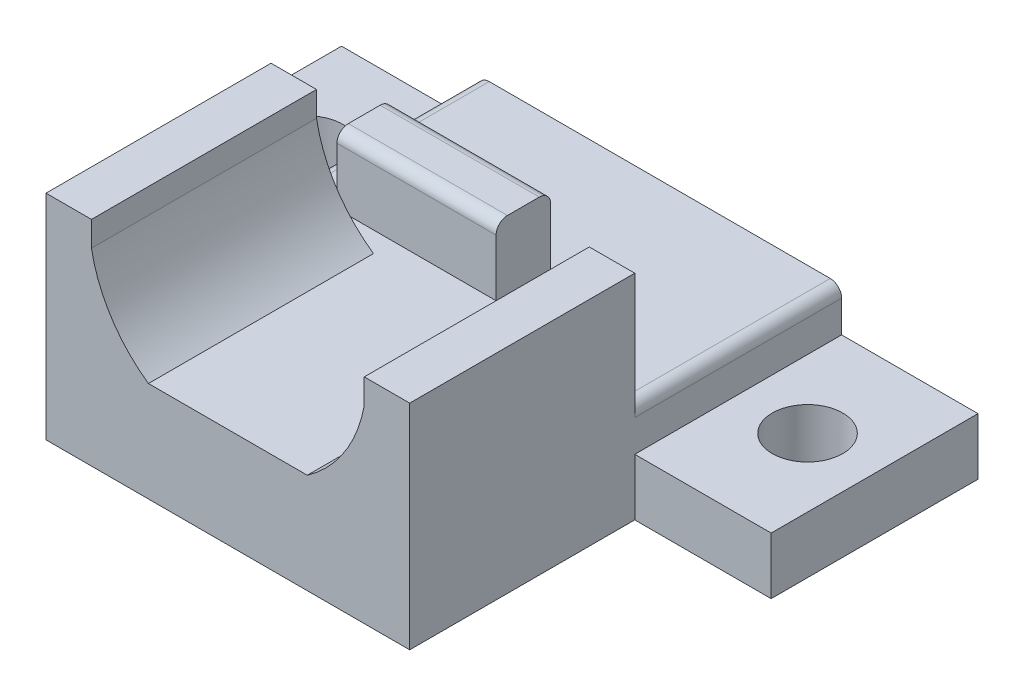
ISO-10303-21;
HEADER;
FILE_DESCRIPTION(('STEP AP214'),'2;1');
FILE_NAME('part.step','',(''),(''),'','','');
FILE_SCHEMA(('AUTOMOTIVE_DESIGN { 1 0 10303 214 1 1 1 1 }'));
ENDSEC;
DATA;
#1=APPLICATION_CONTEXT('core data for automotive mechanical design processes');
#2=APPLICATION_PROTOCOL_DEFINITION('international standard','automotive_design',2000,#1);
#3=PRODUCT_CONTEXT('',#1,'mechanical');
#4=PRODUCT('Part','Part','',(#3));
#5=PRODUCT_RELATED_PRODUCT_CATEGORY('part','',(#4));
#6=PRODUCT_DEFINITION_FORMATION('','',#4);
#7=PRODUCT_DEFINITION_CONTEXT('part definition',#1,'design');
#8=PRODUCT_DEFINITION('design','',#6,#7);
#9=PRODUCT_DEFINITION_SHAPE('','',#8);
#10=(LENGTH_UNIT() NAMED_UNIT(*) SI_UNIT(.MILLI.,.METRE.));
#11=(NAMED_UNIT(*) PLANE_ANGLE_UNIT() SI_UNIT($,.RADIAN.));
#12=(NAMED_UNIT(*) SI_UNIT($,.STERADIAN.) SOLID_ANGLE_UNIT());
#13=UNCERTAINTY_MEASURE_WITH_UNIT(LENGTH_MEASURE(1.E-05),#10,'distance_accuracy_value','');
#14=(GEOMETRIC_REPRESENTATION_CONTEXT(3) GLOBAL_UNCERTAINTY_ASSIGNED_CONTEXT((#13)) GLOBAL_UNIT_ASSIGNED_CONTEXT((#10,
#11,#12)) REPRESENTATION_CONTEXT('',''));
#15=CARTESIAN_POINT('',(0.,0.,0.));
#16=DIRECTION('',(0.,0.,1.));
#17=DIRECTION('',(1.,0.,0.));
#18=AXIS2_PLACEMENT_3D('',#15,#16,#17);
#19=CARTESIAN_POINT('',(0.,4.4,0.));
#20=DIRECTION('',(0.,-1.,0.));
#21=DIRECTION('',(0.,0.,-1.));
#22=AXIS2_PLACEMENT_3D('',#19,#20,#21);
#23=PLANE('',#22);
#24=DIRECTION('',(-1.,0.,0.));
#25=VECTOR('',#24,1.);
#26=CARTESIAN_POINT('',(8.14560264732086,4.4,-0.400000000000001));
#27=LINE('',#26,#25);
#28=CARTESIAN_POINT('',(7.5,4.4,-0.400000000000001));
#29=VERTEX_POINT('',#28);
#30=CARTESIAN_POINT('',(3.49428104193123,4.4,-0.400000000000001));
#31=VERTEX_POINT('',#30);
#32=EDGE_CURVE('E324',#29,#31,#27,.T.);
#33=ORIENTED_EDGE('',*,*,#32,.F.);
#34=DIRECTION('',(0.,0.,1.));
#35=VECTOR('',#34,1.);
#36=CARTESIAN_POINT('',(7.5,4.4,0.));
#37=LINE('',#36,#35);
#38=CARTESIAN_POINT('',(7.5,4.4,-9.5));
#39=VERTEX_POINT('',#38);
#40=EDGE_CURVE('E480',#29,#39,#37,.F.);
#41=ORIENTED_EDGE('',*,*,#40,.T.);
#42=DIRECTION('',(-1.,0.,0.));
#43=VECTOR('',#42,1.);
#44=CARTESIAN_POINT('',(-6.,4.4,-9.5));
#45=LINE('',#44,#43);
#46=CARTESIAN_POINT('',(-7.5,4.4,-9.5));
#47=VERTEX_POINT('',#46);
#48=EDGE_CURVE('E425',#39,#47,#45,.T.);
#49=ORIENTED_EDGE('',*,*,#48,.T.);
#50=DIRECTION('',(0.,0.,-1.));
#51=VECTOR('',#50,1.);
#52=CARTESIAN_POINT('',(-7.5,4.4,0.));
#53=LINE('',#52,#51);
#54=CARTESIAN_POINT('',(-7.5,4.4,-0.400000000000001));
#55=VERTEX_POINT('',#54);
#56=EDGE_CURVE('E478',#47,#55,#53,.F.);
#57=ORIENTED_EDGE('',*,*,#56,.T.);
#58=CARTESIAN_POINT('',(-3.49428104193123,4.4,-0.400000000000001));
#59=VERTEX_POINT('',#58);
#60=EDGE_CURVE('E321',#59,#55,#27,.T.);
#61=ORIENTED_EDGE('',*,*,#60,.F.);
#62=DIRECTION('',(0.,0.,1.));
#63=VECTOR('',#62,1.);
#64=CARTESIAN_POINT('',(-3.49428104193123,4.4,-9.5));
#65=LINE('',#64,#63);
#66=CARTESIAN_POINT('',(-3.49428104193123,4.4,9.5));
#67=VERTEX_POINT('',#66);
#68=EDGE_CURVE('E357',#59,#67,#65,.T.);
#69=ORIENTED_EDGE('',*,*,#68,.T.);
#70=DIRECTION('',(1.,0.,0.));
#71=VECTOR('',#70,1.);
#72=CARTESIAN_POINT('',(0.,4.4,9.5));
#73=LINE('',#72,#71);
#74=CARTESIAN_POINT('',(3.49428104193123,4.4,9.5));
#75=VERTEX_POINT('',#74);
#76=EDGE_CURVE('E344',#67,#75,#73,.T.);
#77=ORIENTED_EDGE('',*,*,#76,.T.);
#78=DIRECTION('',(0.,0.,1.));
#79=VECTOR('',#78,1.);
#80=CARTESIAN_POINT('',(3.49428104193123,4.4,-9.5));
#81=LINE('',#80,#79);
#82=EDGE_CURVE('E355',#31,#75,#81,.T.);
#83=ORIENTED_EDGE('',*,*,#82,.F.);
#84=EDGE_LOOP('',(#33,#41,#49,#57,#61,#69,#77,#83));
#85=FACE_BOUND('',#84,.T.);
#86=DIRECTION('',(0.,0.,1.));
#87=VECTOR('',#86,1.);
#88=CARTESIAN_POINT('',(-6.,4.4,-3.7));
#89=LINE('',#88,#87);
#90=CARTESIAN_POINT('',(-6.,4.4,-3.7));
#91=VERTEX_POINT('',#90);
#92=CARTESIAN_POINT('',(-6.,4.4,-1.3));
#93=VERTEX_POINT('',#92);
#94=EDGE_CURVE('E288',#91,#93,#89,.T.);
#95=ORIENTED_EDGE('',*,*,#94,.F.);
#96=DIRECTION('',(-1.,0.,0.));
#97=VECTOR('',#96,1.);
#98=CARTESIAN_POINT('',(-6.,4.4,-3.7));
#99=LINE('',#98,#97);
#100=CARTESIAN_POINT('',(1.,4.4,-3.7));
#101=VERTEX_POINT('',#100);
#102=EDGE_CURVE('E301',#101,#91,#99,.T.);
#103=ORIENTED_EDGE('',*,*,#102,.F.);
#104=DIRECTION('',(0.,0.,-1.));
#105=VECTOR('',#104,1.);
#106=CARTESIAN_POINT('',(1.,4.4,-3.7));
#107=LINE('',#106,#105);
#108=CARTESIAN_POINT('',(1.,4.4,-1.3));
#109=VERTEX_POINT('',#108);
#110=EDGE_CURVE('E309',#109,#101,#107,.T.);
#111=ORIENTED_EDGE('',*,*,#110,.F.);
#112=DIRECTION('',(1.,0.,0.));
#113=VECTOR('',#112,1.);
#114=CARTESIAN_POINT('',(-6.,4.4,-1.3));
#115=LINE('',#114,#113);
#116=EDGE_CURVE('E304',#93,#109,#115,.T.);
#117=ORIENTED_EDGE('',*,*,#116,.F.);
#118=EDGE_LOOP('',(#95,#103,#111,#117));
#119=FACE_BOUND('',#118,.T.);
#120=ADVANCED_FACE('F111',(#85,#119),#23,.F.);
#121=CARTESIAN_POINT('',(-8.,13.3,9.5));
#122=DIRECTION('',(0.,0.,-1.));
#123=DIRECTION('',(-1.,0.,0.));
#124=AXIS2_PLACEMENT_3D('',#121,#122,#123);
#125=PLANE('',#124);
#126=DIRECTION('',(0.,-1.,0.));
#127=VECTOR('',#126,1.);
#128=CARTESIAN_POINT('',(6.,0.,9.5));
#129=LINE('',#128,#127);
#130=CARTESIAN_POINT('',(6.,9.4,9.5));
#131=VERTEX_POINT('',#130);
#132=CARTESIAN_POINT('',(6.,8.30000000000001,9.5));
#133=VERTEX_POINT('',#132);
#134=EDGE_CURVE('E348',#131,#133,#129,.T.);
#135=ORIENTED_EDGE('',*,*,#134,.T.);
#136=CARTESIAN_POINT('',(0.,9.4,9.5));
#137=DIRECTION('',(0.,0.,1.));
#138=DIRECTION('',(1.,0.,0.));
#139=AXIS2_PLACEMENT_3D('',#136,#137,#138);
#140=CIRCLE('',#139,6.1);
#141=EDGE_CURVE('E345',#75,#133,#140,.T.);
#142=ORIENTED_EDGE('',*,*,#141,.F.);
#143=ORIENTED_EDGE('',*,*,#76,.F.);
#144=CARTESIAN_POINT('',(-6.,8.30000000000001,9.5));
#145=VERTEX_POINT('',#144);
#146=EDGE_CURVE('E341',#145,#67,#140,.T.);
#147=ORIENTED_EDGE('',*,*,#146,.F.);
#148=DIRECTION('',(0.,-1.,0.));
#149=VECTOR('',#148,1.);
#150=CARTESIAN_POINT('',(-6.,0.,9.5));
#151=LINE('',#150,#149);
#152=CARTESIAN_POINT('',(-6.,9.4,9.5));
#153=VERTEX_POINT('',#152);
#154=EDGE_CURVE('E338',#153,#145,#151,.T.);
#155=ORIENTED_EDGE('',*,*,#154,.F.);
#156=DIRECTION('',(1.,0.,0.));
#157=VECTOR('',#156,1.);
#158=CARTESIAN_POINT('',(-8.,9.4,9.5));
#159=LINE('',#158,#157);
#160=CARTESIAN_POINT('',(-8.,9.4,9.5));
#161=VERTEX_POINT('',#160);
#162=EDGE_CURVE('E420',#161,#153,#159,.T.);
#163=ORIENTED_EDGE('',*,*,#162,.F.);
#164=DIRECTION('',(0.,-1.,0.));
#165=VECTOR('',#164,1.);
#166=CARTESIAN_POINT('',(-8.,13.3,9.5));
#167=LINE('',#166,#165);
#168=CARTESIAN_POINT('',(-8.,0.,9.5));
#169=VERTEX_POINT('',#168);
#170=EDGE_CURVE('E439',#161,#169,#167,.T.);
#171=ORIENTED_EDGE('',*,*,#170,.T.);
#172=DIRECTION('',(1.,0.,0.));
#173=VECTOR('',#172,1.);
#174=CARTESIAN_POINT('',(-8.,0.,9.5));
#175=LINE('',#174,#173);
#176=CARTESIAN_POINT('',(8.,0.,9.5));
#177=VERTEX_POINT('',#176);
#178=EDGE_CURVE('E434',#169,#177,#175,.T.);
#179=ORIENTED_EDGE('',*,*,#178,.T.);
#180=DIRECTION('',(0.,-1.,0.));
#181=VECTOR('',#180,1.);
#182=CARTESIAN_POINT('',(8.,13.3,9.5));
#183=LINE('',#182,#181);
#184=CARTESIAN_POINT('',(8.,9.4,9.5));
#185=VERTEX_POINT('',#184);
#186=EDGE_CURVE('E437',#185,#177,#183,.T.);
#187=ORIENTED_EDGE('',*,*,#186,.F.);
#188=EDGE_CURVE('E415',#131,#185,#159,.T.);
#189=ORIENTED_EDGE('',*,*,#188,.F.);
#190=EDGE_LOOP('',(#135,#142,#143,#147,#155,#163,#171,#179,#187,#189));
#191=FACE_BOUND('',#190,.T.);
#192=ADVANCED_FACE('F546',(#191),#125,.F.);
#193=CARTESIAN_POINT('',(6.,4.4,9.5));
#194=DIRECTION('',(1.,0.,0.));
#195=DIRECTION('',(0.,0.,-1.));
#196=AXIS2_PLACEMENT_3D('',#193,#194,#195);
#197=PLANE('',#196);
#198=DIRECTION('',(0.,0.,-1.));
#199=VECTOR('',#198,1.);
#200=CARTESIAN_POINT('',(6.,9.4,9.5));
#201=LINE('',#200,#199);
#202=CARTESIAN_POINT('',(6.,9.4,-0.400000000000001));
#203=VERTEX_POINT('',#202);
#204=EDGE_CURVE('E418',#131,#203,#201,.T.);
#205=ORIENTED_EDGE('',*,*,#204,.T.);
#206=DIRECTION('',(0.,-1.,0.));
#207=VECTOR('',#206,1.);
#208=CARTESIAN_POINT('',(6.,4.4,-0.400000000000001));
#209=LINE('',#208,#207);
#210=CARTESIAN_POINT('',(6.,8.30000000000001,-0.400000000000001));
#211=VERTEX_POINT('',#210);
#212=EDGE_CURVE('E332',#203,#211,#209,.T.);
#213=ORIENTED_EDGE('',*,*,#212,.T.);
#214=DIRECTION('',(0.,0.,1.));
#215=VECTOR('',#214,1.);
#216=CARTESIAN_POINT('',(6.,8.30000000000001,-9.5));
#217=LINE('',#216,#215);
#218=EDGE_CURVE('E352',#211,#133,#217,.T.);
#219=ORIENTED_EDGE('',*,*,#218,.T.);
#220=ORIENTED_EDGE('',*,*,#134,.F.);
#221=EDGE_LOOP('',(#205,#213,#219,#220));
#222=FACE_BOUND('',#221,.T.);
#223=ADVANCED_FACE('F553',(#222),#197,.F.);
#224=CARTESIAN_POINT('',(-6.,4.4,9.5));
#225=DIRECTION('',(-1.,0.,0.));
#226=DIRECTION('',(0.,0.,1.));
#227=AXIS2_PLACEMENT_3D('',#224,#225,#226);
#228=PLANE('',#227);
#229=DIRECTION('',(0.,0.,1.));
#230=VECTOR('',#229,1.);
#231=CARTESIAN_POINT('',(-6.,8.30000000000001,-9.5));
#232=LINE('',#231,#230);
#233=CARTESIAN_POINT('',(-6.,8.30000000000001,-0.400000000000001));
#234=VERTEX_POINT('',#233);
#235=EDGE_CURVE('E351',#234,#145,#232,.T.);
#236=ORIENTED_EDGE('',*,*,#235,.F.);
#237=DIRECTION('',(0.,1.,0.));
#238=VECTOR('',#237,1.);
#239=CARTESIAN_POINT('',(-6.,4.4,-0.400000000000001));
#240=LINE('',#239,#238);
#241=CARTESIAN_POINT('',(-6.,9.4,-0.400000000000001));
#242=VERTEX_POINT('',#241);
#243=EDGE_CURVE('E326',#234,#242,#240,.T.);
#244=ORIENTED_EDGE('',*,*,#243,.T.);
#245=DIRECTION('',(0.,0.,1.));
#246=VECTOR('',#245,1.);
#247=CARTESIAN_POINT('',(-6.,9.4,9.5));
#248=LINE('',#247,#246);
#249=EDGE_CURVE('E446',#242,#153,#248,.T.);
#250=ORIENTED_EDGE('',*,*,#249,.T.);
#251=ORIENTED_EDGE('',*,*,#154,.T.);
#252=EDGE_LOOP('',(#236,#244,#250,#251));
#253=FACE_BOUND('',#252,.T.);
#254=ADVANCED_FACE('F589',(#253),#228,.F.);
#255=CARTESIAN_POINT('',(8.,13.3,9.5));
#256=DIRECTION('',(-1.,0.,0.));
#257=DIRECTION('',(0.,0.,1.));
#258=AXIS2_PLACEMENT_3D('',#255,#256,#257);
#259=PLANE('',#258);
#260=DIRECTION('',(0.,-1.,0.));
#261=VECTOR('',#260,1.);
#262=CARTESIAN_POINT('',(8.,13.3,-9.5));
#263=LINE('',#262,#261);
#264=CARTESIAN_POINT('',(8.,3.9,-9.5));
#265=VERTEX_POINT('',#264);
#266=CARTESIAN_POINT('',(8.,2.5,-9.5));
#267=VERTEX_POINT('',#266);
#268=EDGE_CURVE('E444',#265,#267,#263,.T.);
#269=ORIENTED_EDGE('',*,*,#268,.F.);
#270=DIRECTION('',(0.,0.,1.));
#271=VECTOR('',#270,1.);
#272=CARTESIAN_POINT('',(8.,3.9,9.5));
#273=LINE('',#272,#271);
#274=CARTESIAN_POINT('',(8.,3.9,-0.400000000000001));
#275=VERTEX_POINT('',#274);
#276=EDGE_CURVE('E475',#265,#275,#273,.T.);
#277=ORIENTED_EDGE('',*,*,#276,.T.);
#278=DIRECTION('',(0.,1.,0.));
#279=VECTOR('',#278,1.);
#280=CARTESIAN_POINT('',(8.,13.3,-0.400000000000001));
#281=LINE('',#280,#279);
#282=CARTESIAN_POINT('',(8.,9.4,-0.400000000000001));
#283=VERTEX_POINT('',#282);
#284=EDGE_CURVE('E335',#275,#283,#281,.T.);
#285=ORIENTED_EDGE('',*,*,#284,.T.);
#286=DIRECTION('',(0.,0.,-1.));
#287=VECTOR('',#286,1.);
#288=CARTESIAN_POINT('',(8.,9.4,9.5));
#289=LINE('',#288,#287);
#290=EDGE_CURVE('E410',#185,#283,#289,.T.);
#291=ORIENTED_EDGE('',*,*,#290,.F.);
#292=ORIENTED_EDGE('',*,*,#186,.T.);
#293=DIRECTION('',(0.,0.,-1.));
#294=VECTOR('',#293,1.);
#295=CARTESIAN_POINT('',(8.,0.,9.5));
#296=LINE('',#295,#294);
#297=CARTESIAN_POINT('',(8.,0.,-0.400000000000001));
#298=VERTEX_POINT('',#297);
#299=EDGE_CURVE('E428',#177,#298,#296,.T.);
#300=ORIENTED_EDGE('',*,*,#299,.T.);
#301=DIRECTION('',(0.,-1.,0.));
#302=VECTOR('',#301,1.);
#303=CARTESIAN_POINT('',(8.,13.3,-0.400000000000001));
#304=LINE('',#303,#302);
#305=CARTESIAN_POINT('',(8.,2.5,-0.400000000000001));
#306=VERTEX_POINT('',#305);
#307=EDGE_CURVE('E404',#306,#298,#304,.T.);
#308=ORIENTED_EDGE('',*,*,#307,.F.);
#309=DIRECTION('',(0.,0.,-1.));
#310=VECTOR('',#309,1.);
#311=CARTESIAN_POINT('',(8.,2.5,9.5));
#312=LINE('',#311,#310);
#313=EDGE_CURVE('E407',#306,#267,#312,.T.);
#314=ORIENTED_EDGE('',*,*,#313,.T.);
#315=EDGE_LOOP('',(#269,#277,#285,#291,#292,#300,#308,#314));
#316=FACE_BOUND('',#315,.T.);
#317=ADVANCED_FACE('F502',(#316),#259,.F.);
#318=CARTESIAN_POINT('',(-8.,13.3,9.5));
#319=DIRECTION('',(1.,0.,0.));
#320=DIRECTION('',(0.,0.,-1.));
#321=AXIS2_PLACEMENT_3D('',#318,#319,#320);
#322=PLANE('',#321);
#323=DIRECTION('',(0.,1.,0.));
#324=VECTOR('',#323,1.);
#325=CARTESIAN_POINT('',(-8.,4.4,-0.400000000000001));
#326=LINE('',#325,#324);
#327=CARTESIAN_POINT('',(-8.,3.9,-0.400000000000001));
#328=VERTEX_POINT('',#327);
#329=CARTESIAN_POINT('',(-8.,9.4,-0.400000000000001));
#330=VERTEX_POINT('',#329);
#331=EDGE_CURVE('E126',#328,#330,#326,.T.);
#332=ORIENTED_EDGE('',*,*,#331,.F.);
#333=DIRECTION('',(0.,0.,-1.));
#334=VECTOR('',#333,1.);
#335=CARTESIAN_POINT('',(-8.,3.9,9.5));
#336=LINE('',#335,#334);
#337=CARTESIAN_POINT('',(-8.,3.9,-9.5));
#338=VERTEX_POINT('',#337);
#339=EDGE_CURVE('E485',#328,#338,#336,.T.);
#340=ORIENTED_EDGE('',*,*,#339,.T.);
#341=DIRECTION('',(0.,-1.,0.));
#342=VECTOR('',#341,1.);
#343=CARTESIAN_POINT('',(-8.,13.3,-9.5));
#344=LINE('',#343,#342);
#345=CARTESIAN_POINT('',(-8.,2.5,-9.5));
#346=VERTEX_POINT('',#345);
#347=EDGE_CURVE('E442',#338,#346,#344,.T.);
#348=ORIENTED_EDGE('',*,*,#347,.T.);
#349=DIRECTION('',(0.,0.,1.));
#350=VECTOR('',#349,1.);
#351=CARTESIAN_POINT('',(-8.,2.5,9.5));
#352=LINE('',#351,#350);
#353=CARTESIAN_POINT('',(-8.,2.5,-0.400000000000001));
#354=VERTEX_POINT('',#353);
#355=EDGE_CURVE('E448',#346,#354,#352,.T.);
#356=ORIENTED_EDGE('',*,*,#355,.T.);
#357=DIRECTION('',(0.,1.,0.));
#358=VECTOR('',#357,1.);
#359=CARTESIAN_POINT('',(-8.,13.3,-0.400000000000001));
#360=LINE('',#359,#358);
#361=CARTESIAN_POINT('',(-8.,0.,-0.400000000000001));
#362=VERTEX_POINT('',#361);
#363=EDGE_CURVE('E401',#362,#354,#360,.T.);
#364=ORIENTED_EDGE('',*,*,#363,.F.);
#365=DIRECTION('',(0.,0.,1.));
#366=VECTOR('',#365,1.);
#367=CARTESIAN_POINT('',(-8.,0.,9.5));
#368=LINE('',#367,#366);
#369=EDGE_CURVE('E432',#362,#169,#368,.T.);
#370=ORIENTED_EDGE('',*,*,#369,.T.);
#371=ORIENTED_EDGE('',*,*,#170,.F.);
#372=DIRECTION('',(0.,0.,-1.));
#373=VECTOR('',#372,1.);
#374=CARTESIAN_POINT('',(-8.,9.4,9.5));
#375=LINE('',#374,#373);
#376=EDGE_CURVE('E413',#161,#330,#375,.T.);
#377=ORIENTED_EDGE('',*,*,#376,.T.);
#378=EDGE_LOOP('',(#332,#340,#348,#356,#364,#370,#371,#377));
#379=FACE_BOUND('',#378,.T.);
#380=ADVANCED_FACE('F530',(#379),#322,.F.);
#381=CARTESIAN_POINT('',(-8.,13.3,-9.5));
#382=DIRECTION('',(0.,0.,1.));
#383=DIRECTION('',(1.,0.,0.));
#384=AXIS2_PLACEMENT_3D('',#381,#382,#383);
#385=PLANE('',#384);
#386=ORIENTED_EDGE('',*,*,#48,.F.);
#387=CARTESIAN_POINT('',(7.5,3.9,-9.5));
#388=DIRECTION('',(0.,0.,1.));
#389=DIRECTION('',(1.,0.,0.));
#390=AXIS2_PLACEMENT_3D('',#387,#388,#389);
#391=CIRCLE('',#390,0.5);
#392=EDGE_CURVE('E483',#39,#265,#391,.F.);
#393=ORIENTED_EDGE('',*,*,#392,.T.);
#394=ORIENTED_EDGE('',*,*,#268,.T.);
#395=DIRECTION('',(1.,0.,0.));
#396=VECTOR('',#395,1.);
#397=CARTESIAN_POINT('',(0.,2.5,-9.5));
#398=LINE('',#397,#396);
#399=CARTESIAN_POINT('',(14.,2.5,-9.5));
#400=VERTEX_POINT('',#399);
#401=EDGE_CURVE('E369',#267,#400,#398,.T.);
#402=ORIENTED_EDGE('',*,*,#401,.T.);
#403=DIRECTION('',(0.,-1.,0.));
#404=VECTOR('',#403,1.);
#405=CARTESIAN_POINT('',(14.,2.5,-9.5));
#406=LINE('',#405,#404);
#407=CARTESIAN_POINT('',(14.,0.,-9.5));
#408=VERTEX_POINT('',#407);
#409=EDGE_CURVE('E398',#400,#408,#406,.T.);
#410=ORIENTED_EDGE('',*,*,#409,.T.);
#411=DIRECTION('',(-1.,0.,0.));
#412=VECTOR('',#411,1.);
#413=CARTESIAN_POINT('',(-8.,0.,-9.5));
#414=LINE('',#413,#412);
#415=CARTESIAN_POINT('',(-14.,0.,-9.5));
#416=VERTEX_POINT('',#415);
#417=EDGE_CURVE('E430',#408,#416,#414,.T.);
#418=ORIENTED_EDGE('',*,*,#417,.T.);
#419=DIRECTION('',(0.,-1.,0.));
#420=VECTOR('',#419,1.);
#421=CARTESIAN_POINT('',(-14.,2.5,-9.5));
#422=LINE('',#421,#420);
#423=CARTESIAN_POINT('',(-14.,2.5,-9.5));
#424=VERTEX_POINT('',#423);
#425=EDGE_CURVE('E395',#424,#416,#422,.T.);
#426=ORIENTED_EDGE('',*,*,#425,.F.);
#427=EDGE_CURVE('E371',#424,#346,#398,.T.);
#428=ORIENTED_EDGE('',*,*,#427,.T.);
#429=ORIENTED_EDGE('',*,*,#347,.F.);
#430=CARTESIAN_POINT('',(-7.5,3.9,-9.5));
#431=DIRECTION('',(0.,0.,1.));
#432=DIRECTION('',(1.,0.,0.));
#433=AXIS2_PLACEMENT_3D('',#430,#431,#432);
#434=CIRCLE('',#433,0.5);
#435=EDGE_CURVE('E133',#338,#47,#434,.F.);
#436=ORIENTED_EDGE('',*,*,#435,.T.);
#437=EDGE_LOOP('',(#386,#393,#394,#402,#410,#418,#426,#428,#429,#436));
#438=FACE_BOUND('',#437,.T.);
#439=ADVANCED_FACE('F500',(#438),#385,.F.);
#440=CARTESIAN_POINT('',(0.,0.,0.));
#441=DIRECTION('',(0.,-1.,0.));
#442=DIRECTION('',(0.,0.,-1.));
#443=AXIS2_PLACEMENT_3D('',#440,#441,#442);
#444=PLANE('',#443);
#445=CARTESIAN_POINT('',(-11.,0.,-5.));
#446=DIRECTION('',(0.,1.,0.));
#447=DIRECTION('',(0.,0.,1.));
#448=AXIS2_PLACEMENT_3D('',#445,#446,#447);
#449=CIRCLE('',#448,1.55);
#450=CARTESIAN_POINT('',(-11.,0.,-3.45));
#451=VERTEX_POINT('',#450);
#452=EDGE_CURVE('E360',#451,#451,#449,.T.);
#453=ORIENTED_EDGE('',*,*,#452,.T.);
#454=EDGE_LOOP('',(#453));
#455=FACE_BOUND('',#454,.T.);
#456=CARTESIAN_POINT('',(11.,0.,-5.));
#457=DIRECTION('',(0.,1.,0.));
#458=DIRECTION('',(0.,0.,-1.));
#459=AXIS2_PLACEMENT_3D('',#456,#457,#458);
#460=CIRCLE('',#459,1.55);
#461=CARTESIAN_POINT('',(11.,0.,-6.55));
#462=VERTEX_POINT('',#461);
#463=EDGE_CURVE('E354',#462,#462,#460,.T.);
#464=ORIENTED_EDGE('',*,*,#463,.T.);
#465=EDGE_LOOP('',(#464));
#466=FACE_BOUND('',#465,.T.);
#467=ORIENTED_EDGE('',*,*,#417,.F.);
#468=DIRECTION('',(0.,0.,1.));
#469=VECTOR('',#468,1.);
#470=CARTESIAN_POINT('',(14.,0.,0.));
#471=LINE('',#470,#469);
#472=CARTESIAN_POINT('',(14.,0.,-0.400000000000001));
#473=VERTEX_POINT('',#472);
#474=EDGE_CURVE('E381',#408,#473,#471,.T.);
#475=ORIENTED_EDGE('',*,*,#474,.T.);
#476=DIRECTION('',(1.,0.,0.));
#477=VECTOR('',#476,1.);
#478=CARTESIAN_POINT('',(0.,0.,-0.400000000000001));
#479=LINE('',#478,#477);
#480=EDGE_CURVE('E387',#298,#473,#479,.T.);
#481=ORIENTED_EDGE('',*,*,#480,.F.);
#482=ORIENTED_EDGE('',*,*,#299,.F.);
#483=ORIENTED_EDGE('',*,*,#178,.F.);
#484=ORIENTED_EDGE('',*,*,#369,.F.);
#485=CARTESIAN_POINT('',(-14.,0.,-0.400000000000001));
#486=VERTEX_POINT('',#485);
#487=EDGE_CURVE('E370',#486,#362,#479,.T.);
#488=ORIENTED_EDGE('',*,*,#487,.F.);
#489=DIRECTION('',(0.,0.,1.));
#490=VECTOR('',#489,1.);
#491=CARTESIAN_POINT('',(-14.,0.,0.));
#492=LINE('',#491,#490);
#493=EDGE_CURVE('E384',#416,#486,#492,.T.);
#494=ORIENTED_EDGE('',*,*,#493,.F.);
#495=EDGE_LOOP('',(#467,#475,#481,#482,#483,#484,#488,#494));
#496=FACE_BOUND('',#495,.T.);
#497=ADVANCED_FACE('F516',(#455,#466,#496),#444,.T.);
#498=CARTESIAN_POINT('',(-8.,9.4,9.5));
#499=DIRECTION('',(0.,-1.,0.));
#500=DIRECTION('',(0.,0.,-1.));
#501=AXIS2_PLACEMENT_3D('',#498,#499,#500);
#502=PLANE('',#501);
#503=DIRECTION('',(1.,0.,0.));
#504=VECTOR('',#503,1.);
#505=CARTESIAN_POINT('',(-8.,9.4,-0.4));
#506=LINE('',#505,#504);
#507=EDGE_CURVE('E416',#330,#242,#506,.T.);
#508=ORIENTED_EDGE('',*,*,#507,.F.);
#509=ORIENTED_EDGE('',*,*,#376,.F.);
#510=ORIENTED_EDGE('',*,*,#162,.T.);
#511=ORIENTED_EDGE('',*,*,#249,.F.);
#512=EDGE_LOOP('',(#508,#509,#510,#511));
#513=FACE_BOUND('',#512,.T.);
#514=ADVANCED_FACE('F596',(#513),#502,.F.);
#515=ORIENTED_EDGE('',*,*,#188,.T.);
#516=ORIENTED_EDGE('',*,*,#290,.T.);
#517=EDGE_CURVE('E419',#203,#283,#506,.T.);
#518=ORIENTED_EDGE('',*,*,#517,.F.);
#519=ORIENTED_EDGE('',*,*,#204,.F.);
#520=EDGE_LOOP('',(#515,#516,#518,#519));
#521=FACE_BOUND('',#520,.T.);
#522=ADVANCED_FACE('F557',(#521),#502,.F.);
#523=CARTESIAN_POINT('',(-14.,2.5,0.));
#524=DIRECTION('',(1.,0.,0.));
#525=DIRECTION('',(0.,0.,-1.));
#526=AXIS2_PLACEMENT_3D('',#523,#524,#525);
#527=PLANE('',#526);
#528=ORIENTED_EDGE('',*,*,#493,.T.);
#529=DIRECTION('',(0.,-1.,0.));
#530=VECTOR('',#529,1.);
#531=CARTESIAN_POINT('',(-14.,2.5,-0.400000000000001));
#532=LINE('',#531,#530);
#533=CARTESIAN_POINT('',(-14.,2.5,-0.400000000000001));
#534=VERTEX_POINT('',#533);
#535=EDGE_CURVE('E392',#534,#486,#532,.T.);
#536=ORIENTED_EDGE('',*,*,#535,.F.);
#537=DIRECTION('',(0.,0.,1.));
#538=VECTOR('',#537,1.);
#539=CARTESIAN_POINT('',(-14.,2.5,0.));
#540=LINE('',#539,#538);
#541=EDGE_CURVE('E374',#424,#534,#540,.T.);
#542=ORIENTED_EDGE('',*,*,#541,.F.);
#543=ORIENTED_EDGE('',*,*,#425,.T.);
#544=EDGE_LOOP('',(#528,#536,#542,#543));
#545=FACE_BOUND('',#544,.T.);
#546=ADVANCED_FACE('F522',(#545),#527,.F.);
#547=CARTESIAN_POINT('',(0.,2.5,0.));
#548=DIRECTION('',(0.,1.,0.));
#549=DIRECTION('',(0.,0.,1.));
#550=AXIS2_PLACEMENT_3D('',#547,#548,#549);
#551=PLANE('',#550);
#552=CARTESIAN_POINT('',(-11.,2.5,-5.));
#553=DIRECTION('',(0.,1.,0.));
#554=DIRECTION('',(0.,0.,1.));
#555=AXIS2_PLACEMENT_3D('',#552,#553,#554);
#556=CIRCLE('',#555,1.55);
#557=CARTESIAN_POINT('',(-11.,2.5,-3.45));
#558=VERTEX_POINT('',#557);
#559=EDGE_CURVE('E385',#558,#558,#556,.T.);
#560=ORIENTED_EDGE('',*,*,#559,.F.);
#561=EDGE_LOOP('',(#560));
#562=FACE_BOUND('',#561,.T.);
#563=ORIENTED_EDGE('',*,*,#355,.F.);
#564=ORIENTED_EDGE('',*,*,#427,.F.);
#565=ORIENTED_EDGE('',*,*,#541,.T.);
#566=DIRECTION('',(1.,0.,0.));
#567=VECTOR('',#566,1.);
#568=CARTESIAN_POINT('',(0.,2.5,-0.400000000000001));
#569=LINE('',#568,#567);
#570=EDGE_CURVE('E377',#534,#354,#569,.T.);
#571=ORIENTED_EDGE('',*,*,#570,.T.);
#572=EDGE_LOOP('',(#563,#564,#565,#571));
#573=FACE_BOUND('',#572,.T.);
#574=ADVANCED_FACE('F528',(#562,#573),#551,.T.);
#575=CARTESIAN_POINT('',(0.,2.5,-0.400000000000001));
#576=DIRECTION('',(0.,0.,-1.));
#577=DIRECTION('',(-1.,0.,0.));
#578=AXIS2_PLACEMENT_3D('',#575,#576,#577);
#579=PLANE('',#578);
#580=ORIENTED_EDGE('',*,*,#487,.T.);
#581=ORIENTED_EDGE('',*,*,#363,.T.);
#582=ORIENTED_EDGE('',*,*,#570,.F.);
#583=ORIENTED_EDGE('',*,*,#535,.T.);
#584=EDGE_LOOP('',(#580,#581,#582,#583));
#585=FACE_BOUND('',#584,.T.);
#586=ADVANCED_FACE('F567',(#585),#579,.F.);
#587=CARTESIAN_POINT('',(11.,2.5,-5.));
#588=DIRECTION('',(0.,1.,0.));
#589=DIRECTION('',(0.,0.,1.));
#590=AXIS2_PLACEMENT_3D('',#587,#588,#589);
#591=CIRCLE('',#590,1.55);
#592=CARTESIAN_POINT('',(11.,2.5,-3.45));
#593=VERTEX_POINT('',#592);
#594=EDGE_CURVE('E363',#593,#593,#591,.T.);
#595=ORIENTED_EDGE('',*,*,#594,.F.);
#596=EDGE_LOOP('',(#595));
#597=FACE_BOUND('',#596,.T.);
#598=ORIENTED_EDGE('',*,*,#313,.F.);
#599=CARTESIAN_POINT('',(14.,2.5,-0.400000000000001));
#600=VERTEX_POINT('',#599);
#601=EDGE_CURVE('E376',#306,#600,#569,.T.);
#602=ORIENTED_EDGE('',*,*,#601,.T.);
#603=DIRECTION('',(0.,0.,1.));
#604=VECTOR('',#603,1.);
#605=CARTESIAN_POINT('',(14.,2.5,0.));
#606=LINE('',#605,#604);
#607=EDGE_CURVE('E366',#400,#600,#606,.T.);
#608=ORIENTED_EDGE('',*,*,#607,.F.);
#609=ORIENTED_EDGE('',*,*,#401,.F.);
#610=EDGE_LOOP('',(#598,#602,#608,#609));
#611=FACE_BOUND('',#610,.T.);
#612=ADVANCED_FACE('F508',(#597,#611),#551,.T.);
#613=ORIENTED_EDGE('',*,*,#601,.F.);
#614=ORIENTED_EDGE('',*,*,#307,.T.);
#615=ORIENTED_EDGE('',*,*,#480,.T.);
#616=DIRECTION('',(0.,-1.,0.));
#617=VECTOR('',#616,1.);
#618=CARTESIAN_POINT('',(14.,2.5,-0.400000000000001));
#619=LINE('',#618,#617);
#620=EDGE_CURVE('E380',#600,#473,#619,.T.);
#621=ORIENTED_EDGE('',*,*,#620,.F.);
#622=EDGE_LOOP('',(#613,#614,#615,#621));
#623=FACE_BOUND('',#622,.T.);
#624=ADVANCED_FACE('F564',(#623),#579,.F.);
#625=CARTESIAN_POINT('',(14.,2.5,0.));
#626=DIRECTION('',(1.,0.,0.));
#627=DIRECTION('',(0.,0.,-1.));
#628=AXIS2_PLACEMENT_3D('',#625,#626,#627);
#629=PLANE('',#628);
#630=ORIENTED_EDGE('',*,*,#474,.F.);
#631=ORIENTED_EDGE('',*,*,#409,.F.);
#632=ORIENTED_EDGE('',*,*,#607,.T.);
#633=ORIENTED_EDGE('',*,*,#620,.T.);
#634=EDGE_LOOP('',(#630,#631,#632,#633));
#635=FACE_BOUND('',#634,.T.);
#636=ADVANCED_FACE('F512',(#635),#629,.T.);
#637=CARTESIAN_POINT('',(11.,0.,-5.));
#638=DIRECTION('',(0.,1.,0.));
#639=DIRECTION('',(0.,0.,1.));
#640=AXIS2_PLACEMENT_3D('',#637,#638,#639);
#641=CYLINDRICAL_SURFACE('',#640,1.55);
#642=ORIENTED_EDGE('',*,*,#594,.T.);
#643=EDGE_LOOP('',(#642));
#644=FACE_BOUND('',#643,.T.);
#645=ORIENTED_EDGE('',*,*,#463,.F.);
#646=EDGE_LOOP('',(#645));
#647=FACE_BOUND('',#646,.T.);
#648=ADVANCED_FACE('F572',(#644,#647),#641,.F.);
#649=CARTESIAN_POINT('',(-11.,0.,-5.));
#650=DIRECTION('',(0.,1.,0.));
#651=DIRECTION('',(0.,0.,1.));
#652=AXIS2_PLACEMENT_3D('',#649,#650,#651);
#653=CYLINDRICAL_SURFACE('',#652,1.55);
#654=ORIENTED_EDGE('',*,*,#559,.T.);
#655=EDGE_LOOP('',(#654));
#656=FACE_BOUND('',#655,.T.);
#657=ORIENTED_EDGE('',*,*,#452,.F.);
#658=EDGE_LOOP('',(#657));
#659=FACE_BOUND('',#658,.T.);
#660=ADVANCED_FACE('F715',(#656,#659),#653,.F.);
#661=CARTESIAN_POINT('',(0.,9.4,-9.5));
#662=DIRECTION('',(0.,0.,1.));
#663=DIRECTION('',(1.,0.,0.));
#664=AXIS2_PLACEMENT_3D('',#661,#662,#663);
#665=CYLINDRICAL_SURFACE('',#664,6.1);
#666=ORIENTED_EDGE('',*,*,#218,.F.);
#667=CARTESIAN_POINT('',(0.,9.4,-0.400000000000001));
#668=DIRECTION('',(0.,0.,1.));
#669=DIRECTION('',(1.,0.,0.));
#670=AXIS2_PLACEMENT_3D('',#667,#668,#669);
#671=CIRCLE('',#670,6.1);
#672=EDGE_CURVE('E329',#211,#31,#671,.F.);
#673=ORIENTED_EDGE('',*,*,#672,.T.);
#674=ORIENTED_EDGE('',*,*,#82,.T.);
#675=ORIENTED_EDGE('',*,*,#141,.T.);
#676=EDGE_LOOP('',(#666,#673,#674,#675));
#677=FACE_BOUND('',#676,.T.);
#678=ADVANCED_FACE('F551',(#677),#665,.F.);
#679=ORIENTED_EDGE('',*,*,#68,.F.);
#680=CARTESIAN_POINT('',(0.,9.4,-0.400000000000001));
#681=DIRECTION('',(0.,0.,1.));
#682=DIRECTION('',(1.,0.,0.));
#683=AXIS2_PLACEMENT_3D('',#680,#681,#682);
#684=CIRCLE('',#683,6.1);
#685=EDGE_CURVE('E450',#59,#234,#684,.F.);
#686=ORIENTED_EDGE('',*,*,#685,.T.);
#687=ORIENTED_EDGE('',*,*,#235,.T.);
#688=ORIENTED_EDGE('',*,*,#146,.T.);
#689=EDGE_LOOP('',(#679,#686,#687,#688));
#690=FACE_BOUND('',#689,.T.);
#691=ADVANCED_FACE('F539',(#690),#665,.F.);
#692=CARTESIAN_POINT('',(0.,0.,-0.400000000000001));
#693=DIRECTION('',(0.,0.,1.));
#694=DIRECTION('',(1.,0.,0.));
#695=AXIS2_PLACEMENT_3D('',#692,#693,#694);
#696=PLANE('',#695);
#697=ORIENTED_EDGE('',*,*,#284,.F.);
#698=CARTESIAN_POINT('',(7.5,3.9,-0.400000000000001));
#699=DIRECTION('',(0.,0.,1.));
#700=DIRECTION('',(1.,0.,0.));
#701=AXIS2_PLACEMENT_3D('',#698,#699,#700);
#702=CIRCLE('',#701,0.5);
#703=EDGE_CURVE('E119',#275,#29,#702,.T.);
#704=ORIENTED_EDGE('',*,*,#703,.T.);
#705=ORIENTED_EDGE('',*,*,#32,.T.);
#706=ORIENTED_EDGE('',*,*,#672,.F.);
#707=ORIENTED_EDGE('',*,*,#212,.F.);
#708=ORIENTED_EDGE('',*,*,#517,.T.);
#709=EDGE_LOOP('',(#697,#704,#705,#706,#707,#708));
#710=FACE_BOUND('',#709,.T.);
#711=ADVANCED_FACE('F489',(#710),#696,.F.);
#712=ORIENTED_EDGE('',*,*,#243,.F.);
#713=ORIENTED_EDGE('',*,*,#685,.F.);
#714=ORIENTED_EDGE('',*,*,#60,.T.);
#715=CARTESIAN_POINT('',(-7.5,3.9,-0.400000000000001));
#716=DIRECTION('',(0.,0.,1.));
#717=DIRECTION('',(1.,0.,0.));
#718=AXIS2_PLACEMENT_3D('',#715,#716,#717);
#719=CIRCLE('',#718,0.5);
#720=EDGE_CURVE('E12',#55,#328,#719,.T.);
#721=ORIENTED_EDGE('',*,*,#720,.T.);
#722=ORIENTED_EDGE('',*,*,#331,.T.);
#723=ORIENTED_EDGE('',*,*,#507,.T.);
#724=EDGE_LOOP('',(#712,#713,#714,#721,#722,#723));
#725=FACE_BOUND('',#724,.T.);
#726=ADVANCED_FACE('F534',(#725),#696,.F.);
#727=CARTESIAN_POINT('',(-6.,7.4,-3.7));
#728=DIRECTION('',(1.,0.,0.));
#729=DIRECTION('',(0.,0.,-1.));
#730=AXIS2_PLACEMENT_3D('',#727,#728,#729);
#731=PLANE('',#730);
#732=DIRECTION('',(0.,-1.,0.));
#733=VECTOR('',#732,1.);
#734=CARTESIAN_POINT('',(-6.,7.4,-1.3));
#735=LINE('',#734,#733);
#736=CARTESIAN_POINT('',(-6.,6.9,-1.3));
#737=VERTEX_POINT('',#736);
#738=EDGE_CURVE('E319',#737,#93,#735,.T.);
#739=ORIENTED_EDGE('',*,*,#738,.F.);
#740=CARTESIAN_POINT('',(-6.,6.9,-1.8));
#741=DIRECTION('',(1.,0.,0.));
#742=DIRECTION('',(0.,0.,-1.));
#743=AXIS2_PLACEMENT_3D('',#740,#741,#742);
#744=CIRCLE('',#743,0.5);
#745=CARTESIAN_POINT('',(-6.,7.4,-1.8));
#746=VERTEX_POINT('',#745);
#747=EDGE_CURVE('E473',#737,#746,#744,.F.);
#748=ORIENTED_EDGE('',*,*,#747,.T.);
#749=DIRECTION('',(0.,0.,1.));
#750=VECTOR('',#749,1.);
#751=CARTESIAN_POINT('',(-6.,7.4,-3.7));
#752=LINE('',#751,#750);
#753=CARTESIAN_POINT('',(-6.,7.4,-3.2));
#754=VERTEX_POINT('',#753);
#755=EDGE_CURVE('E308',#754,#746,#752,.T.);
#756=ORIENTED_EDGE('',*,*,#755,.F.);
#757=CARTESIAN_POINT('',(-6.,6.9,-3.2));
#758=DIRECTION('',(1.,0.,0.));
#759=DIRECTION('',(0.,0.,-1.));
#760=AXIS2_PLACEMENT_3D('',#757,#758,#759);
#761=CIRCLE('',#760,0.5);
#762=CARTESIAN_POINT('',(-6.,6.9,-3.7));
#763=VERTEX_POINT('',#762);
#764=EDGE_CURVE('E290',#754,#763,#761,.F.);
#765=ORIENTED_EDGE('',*,*,#764,.T.);
#766=DIRECTION('',(0.,-1.,0.));
#767=VECTOR('',#766,1.);
#768=CARTESIAN_POINT('',(-6.,7.4,-3.7));
#769=LINE('',#768,#767);
#770=EDGE_CURVE('E284',#763,#91,#769,.T.);
#771=ORIENTED_EDGE('',*,*,#770,.T.);
#772=ORIENTED_EDGE('',*,*,#94,.T.);
#773=EDGE_LOOP('',(#739,#748,#756,#765,#771,#772));
#774=FACE_BOUND('',#773,.T.);
#775=ADVANCED_FACE('F287',(#774),#731,.F.);
#776=CARTESIAN_POINT('',(-6.,7.4,-1.3));
#777=DIRECTION('',(0.,0.,-1.));
#778=DIRECTION('',(-1.,0.,0.));
#779=AXIS2_PLACEMENT_3D('',#776,#777,#778);
#780=PLANE('',#779);
#781=DIRECTION('',(0.,-1.,0.));
#782=VECTOR('',#781,1.);
#783=CARTESIAN_POINT('',(1.,7.4,-1.3));
#784=LINE('',#783,#782);
#785=CARTESIAN_POINT('',(1.,6.9,-1.3));
#786=VERTEX_POINT('',#785);
#787=EDGE_CURVE('E317',#786,#109,#784,.T.);
#788=ORIENTED_EDGE('',*,*,#787,.F.);
#789=DIRECTION('',(1.,0.,0.));
#790=VECTOR('',#789,1.);
#791=CARTESIAN_POINT('',(-6.,6.9,-1.3));
#792=LINE('',#791,#790);
#793=EDGE_CURVE('E471',#786,#737,#792,.F.);
#794=ORIENTED_EDGE('',*,*,#793,.T.);
#795=ORIENTED_EDGE('',*,*,#738,.T.);
#796=ORIENTED_EDGE('',*,*,#116,.T.);
#797=EDGE_LOOP('',(#788,#794,#795,#796));
#798=FACE_BOUND('',#797,.T.);
#799=ADVANCED_FACE('F664',(#798),#780,.F.);
#800=CARTESIAN_POINT('',(1.,7.4,-3.7));
#801=DIRECTION('',(-1.,0.,0.));
#802=DIRECTION('',(0.,0.,1.));
#803=AXIS2_PLACEMENT_3D('',#800,#801,#802);
#804=PLANE('',#803);
#805=DIRECTION('',(0.,0.,-1.));
#806=VECTOR('',#805,1.);
#807=CARTESIAN_POINT('',(1.,7.4,-3.7));
#808=LINE('',#807,#806);
#809=CARTESIAN_POINT('',(1.,7.4,-1.8));
#810=VERTEX_POINT('',#809);
#811=CARTESIAN_POINT('',(1.,7.4,-3.2));
#812=VERTEX_POINT('',#811);
#813=EDGE_CURVE('E295',#810,#812,#808,.T.);
#814=ORIENTED_EDGE('',*,*,#813,.F.);
#815=CARTESIAN_POINT('',(1.,6.9,-1.8));
#816=DIRECTION('',(-1.,0.,0.));
#817=DIRECTION('',(0.,0.,1.));
#818=AXIS2_PLACEMENT_3D('',#815,#816,#817);
#819=CIRCLE('',#818,0.5);
#820=EDGE_CURVE('E469',#810,#786,#819,.F.);
#821=ORIENTED_EDGE('',*,*,#820,.T.);
#822=ORIENTED_EDGE('',*,*,#787,.T.);
#823=ORIENTED_EDGE('',*,*,#110,.T.);
#824=DIRECTION('',(0.,-1.,0.));
#825=VECTOR('',#824,1.);
#826=CARTESIAN_POINT('',(1.,7.4,-3.7));
#827=LINE('',#826,#825);
#828=CARTESIAN_POINT('',(1.,6.9,-3.7));
#829=VERTEX_POINT('',#828);
#830=EDGE_CURVE('E294',#829,#101,#827,.T.);
#831=ORIENTED_EDGE('',*,*,#830,.F.);
#832=CARTESIAN_POINT('',(1.,6.9,-3.2));
#833=DIRECTION('',(-1.,0.,0.));
#834=DIRECTION('',(0.,0.,1.));
#835=AXIS2_PLACEMENT_3D('',#832,#833,#834);
#836=CIRCLE('',#835,0.5);
#837=EDGE_CURVE('E463',#829,#812,#836,.F.);
#838=ORIENTED_EDGE('',*,*,#837,.T.);
#839=EDGE_LOOP('',(#814,#821,#822,#823,#831,#838));
#840=FACE_BOUND('',#839,.T.);
#841=ADVANCED_FACE('F655',(#840),#804,.F.);
#842=CARTESIAN_POINT('',(-6.,7.4,-3.7));
#843=DIRECTION('',(0.,0.,1.));
#844=DIRECTION('',(1.,0.,0.));
#845=AXIS2_PLACEMENT_3D('',#842,#843,#844);
#846=PLANE('',#845);
#847=ORIENTED_EDGE('',*,*,#770,.F.);
#848=DIRECTION('',(-1.,0.,0.));
#849=VECTOR('',#848,1.);
#850=CARTESIAN_POINT('',(1.,6.9,-3.7));
#851=LINE('',#850,#849);
#852=EDGE_CURVE('E461',#763,#829,#851,.F.);
#853=ORIENTED_EDGE('',*,*,#852,.T.);
#854=ORIENTED_EDGE('',*,*,#830,.T.);
#855=ORIENTED_EDGE('',*,*,#102,.T.);
#856=EDGE_LOOP('',(#847,#853,#854,#855));
#857=FACE_BOUND('',#856,.T.);
#858=ADVANCED_FACE('F306',(#857),#846,.F.);
#859=CARTESIAN_POINT('',(0.,7.4,0.));
#860=DIRECTION('',(0.,1.,0.));
#861=DIRECTION('',(0.,0.,1.));
#862=AXIS2_PLACEMENT_3D('',#859,#860,#861);
#863=PLANE('',#862);
#864=ORIENTED_EDGE('',*,*,#755,.T.);
#865=DIRECTION('',(1.,0.,0.));
#866=VECTOR('',#865,1.);
#867=CARTESIAN_POINT('',(1.,7.4,-1.8));
#868=LINE('',#867,#866);
#869=EDGE_CURVE('E466',#746,#810,#868,.T.);
#870=ORIENTED_EDGE('',*,*,#869,.T.);
#871=ORIENTED_EDGE('',*,*,#813,.T.);
#872=DIRECTION('',(-1.,0.,0.));
#873=VECTOR('',#872,1.);
#874=CARTESIAN_POINT('',(-6.,7.4,-3.2));
#875=LINE('',#874,#873);
#876=EDGE_CURVE('E457',#812,#754,#875,.T.);
#877=ORIENTED_EDGE('',*,*,#876,.T.);
#878=EDGE_LOOP('',(#864,#870,#871,#877));
#879=FACE_BOUND('',#878,.T.);
#880=ADVANCED_FACE('F608',(#879),#863,.T.);
#881=CARTESIAN_POINT('',(0.,6.9,-3.2));
#882=DIRECTION('',(1.,0.,0.));
#883=DIRECTION('',(0.,0.,-1.));
#884=AXIS2_PLACEMENT_3D('',#881,#882,#883);
#885=CYLINDRICAL_SURFACE('',#884,0.5);
#886=ORIENTED_EDGE('',*,*,#837,.F.);
#887=ORIENTED_EDGE('',*,*,#852,.F.);
#888=ORIENTED_EDGE('',*,*,#764,.F.);
#889=ORIENTED_EDGE('',*,*,#876,.F.);
#890=EDGE_LOOP('',(#886,#887,#888,#889));
#891=FACE_BOUND('',#890,.T.);
#892=ADVANCED_FACE('F604',(#891),#885,.T.);
#893=CARTESIAN_POINT('',(0.,6.9,-1.8));
#894=DIRECTION('',(-1.,0.,0.));
#895=DIRECTION('',(0.,0.,1.));
#896=AXIS2_PLACEMENT_3D('',#893,#894,#895);
#897=CYLINDRICAL_SURFACE('',#896,0.5);
#898=ORIENTED_EDGE('',*,*,#747,.F.);
#899=ORIENTED_EDGE('',*,*,#793,.F.);
#900=ORIENTED_EDGE('',*,*,#820,.F.);
#901=ORIENTED_EDGE('',*,*,#869,.F.);
#902=EDGE_LOOP('',(#898,#899,#900,#901));
#903=FACE_BOUND('',#902,.T.);
#904=ADVANCED_FACE('F607',(#903),#897,.T.);
#905=CARTESIAN_POINT('',(7.5,3.9,9.5));
#906=DIRECTION('',(0.,0.,1.));
#907=DIRECTION('',(1.,0.,0.));
#908=AXIS2_PLACEMENT_3D('',#905,#906,#907);
#909=CYLINDRICAL_SURFACE('',#908,0.5);
#910=ORIENTED_EDGE('',*,*,#392,.F.);
#911=ORIENTED_EDGE('',*,*,#40,.F.);
#912=ORIENTED_EDGE('',*,*,#703,.F.);
#913=ORIENTED_EDGE('',*,*,#276,.F.);
#914=EDGE_LOOP('',(#910,#911,#912,#913));
#915=FACE_BOUND('',#914,.T.);
#916=ADVANCED_FACE('F497',(#915),#909,.T.);
#917=CARTESIAN_POINT('',(-7.5,3.9,9.5));
#918=DIRECTION('',(0.,0.,-1.));
#919=DIRECTION('',(-1.,0.,0.));
#920=AXIS2_PLACEMENT_3D('',#917,#918,#919);
#921=CYLINDRICAL_SURFACE('',#920,0.5);
#922=ORIENTED_EDGE('',*,*,#720,.F.);
#923=ORIENTED_EDGE('',*,*,#56,.F.);
#924=ORIENTED_EDGE('',*,*,#435,.F.);
#925=ORIENTED_EDGE('',*,*,#339,.F.);
#926=EDGE_LOOP('',(#922,#923,#924,#925));
#927=FACE_BOUND('',#926,.T.);
#928=ADVANCED_FACE('F113',(#927),#921,.T.);
#929=CLOSED_SHELL('',(#120,#192,#223,#254,#317,#380,#439,#497,#514,#522,#546,#574,#586,#612,
#624,#636,#648,#660,#678,#691,#711,#726,#775,#799,#841,#858,#880,#892,#904,#916,#928));
#930=MANIFOLD_SOLID_BREP('B2',#929);
#931=ADVANCED_BREP_SHAPE_REPRESENTATION('',(#18,#930),#14);
#932=SHAPE_DEFINITION_REPRESENTATION(#9,#931);
ENDSEC;
END-ISO-10303-21;
